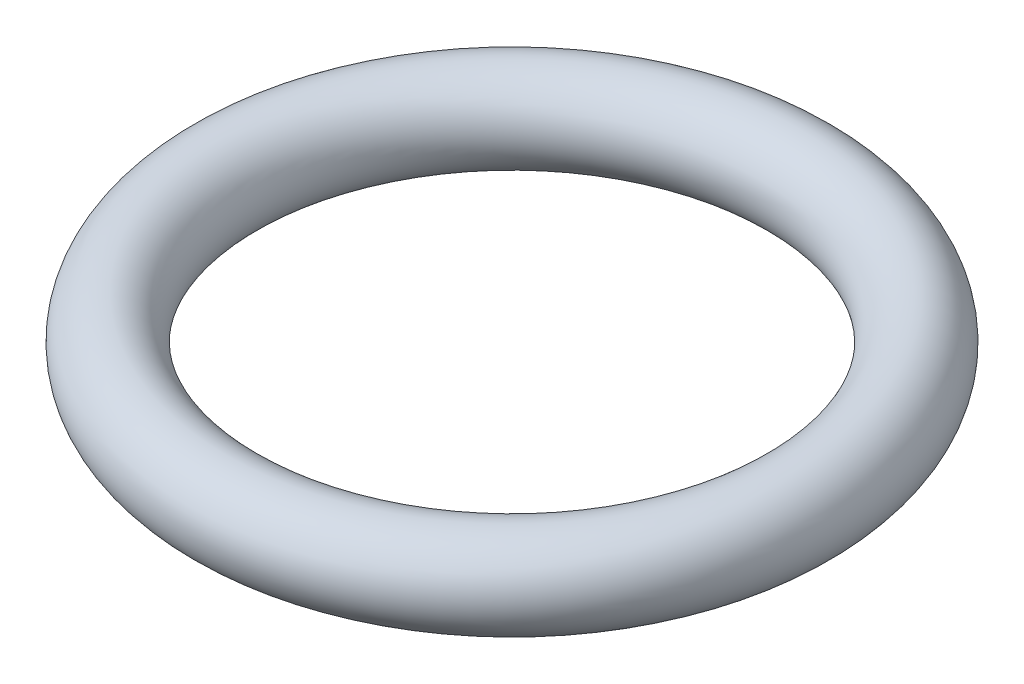
ISO-10303-21;
HEADER;
FILE_DESCRIPTION(('STEP AP214'),'2;1');
FILE_NAME('part.step','',(''),(''),'','','');
FILE_SCHEMA(('AUTOMOTIVE_DESIGN { 1 0 10303 214 1 1 1 1 }'));
ENDSEC;
DATA;
#1=APPLICATION_CONTEXT('core data for automotive mechanical design processes');
#2=APPLICATION_PROTOCOL_DEFINITION('international standard','automotive_design',2000,#1);
#3=PRODUCT_CONTEXT('',#1,'mechanical');
#4=PRODUCT('Part','Part','',(#3));
#5=PRODUCT_RELATED_PRODUCT_CATEGORY('part','',(#4));
#6=PRODUCT_DEFINITION_FORMATION('','',#4);
#7=PRODUCT_DEFINITION_CONTEXT('part definition',#1,'design');
#8=PRODUCT_DEFINITION('design','',#6,#7);
#9=PRODUCT_DEFINITION_SHAPE('','',#8);
#10=(LENGTH_UNIT() NAMED_UNIT(*) SI_UNIT(.MILLI.,.METRE.));
#11=(NAMED_UNIT(*) PLANE_ANGLE_UNIT() SI_UNIT($,.RADIAN.));
#12=(NAMED_UNIT(*) SI_UNIT($,.STERADIAN.) SOLID_ANGLE_UNIT());
#13=UNCERTAINTY_MEASURE_WITH_UNIT(LENGTH_MEASURE(1.E-05),#10,'distance_accuracy_value','');
#14=(GEOMETRIC_REPRESENTATION_CONTEXT(3) GLOBAL_UNCERTAINTY_ASSIGNED_CONTEXT((#13)) GLOBAL_UNIT_ASSIGNED_CONTEXT((#10,
#11,#12)) REPRESENTATION_CONTEXT('',''));
#15=CARTESIAN_POINT('',(0.,0.,0.));
#16=DIRECTION('',(0.,0.,1.));
#17=DIRECTION('',(1.,0.,0.));
#18=AXIS2_PLACEMENT_3D('',#15,#16,#17);
#19=CARTESIAN_POINT('',(0.,0.,0.));
#20=DIRECTION('',(0.,-1.,0.));
#21=DIRECTION('',(0.,0.,-1.));
#22=AXIS2_PLACEMENT_3D('',#19,#20,#21);
#23=TOROIDAL_SURFACE('',#22,5.9,0.899999999999999);
#24=CARTESIAN_POINT('',(0.,0.,-6.8));
#25=VERTEX_POINT('',#24);
#26=VERTEX_LOOP('',#25);
#27=FACE_BOUND('',#26,.T.);
#28=ADVANCED_FACE('F28',(#27),#23,.T.);
#29=CLOSED_SHELL('',(#28));
#30=MANIFOLD_SOLID_BREP('B2',#29);
#31=ADVANCED_BREP_SHAPE_REPRESENTATION('',(#18,#30),#14);
#32=SHAPE_DEFINITION_REPRESENTATION(#9,#31);
ENDSEC;
END-ISO-10303-21;
